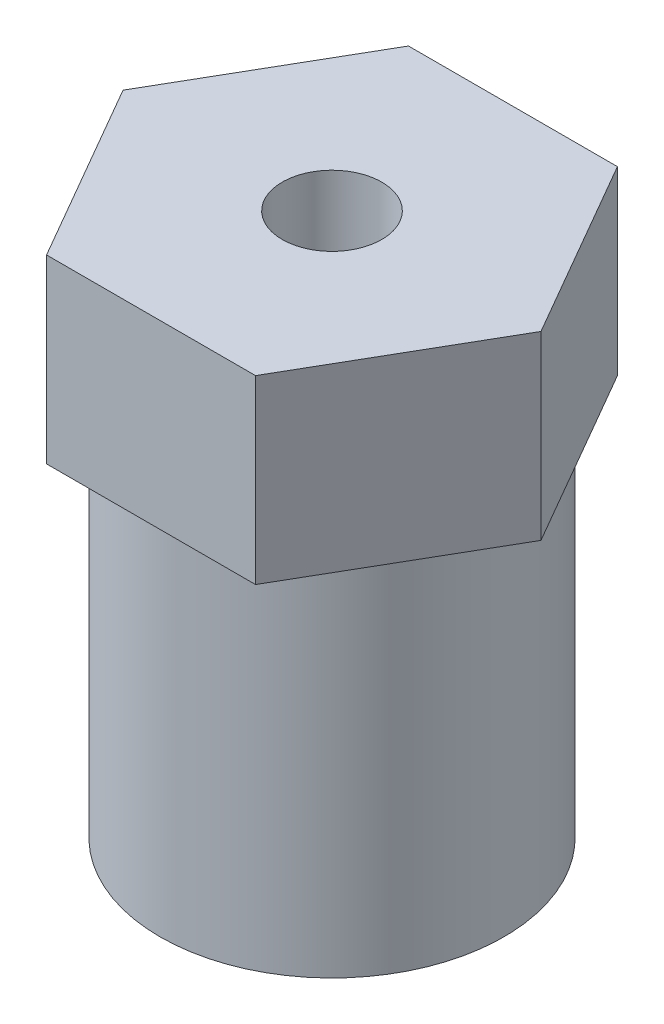
ISO-10303-21;
HEADER;
FILE_DESCRIPTION(('STEP AP214'),'2;1');
FILE_NAME('part.step','',(''),(''),'','','');
FILE_SCHEMA(('AUTOMOTIVE_DESIGN { 1 0 10303 214 1 1 1 1 }'));
ENDSEC;
DATA;
#1=APPLICATION_CONTEXT('core data for automotive mechanical design processes');
#2=APPLICATION_PROTOCOL_DEFINITION('international standard','automotive_design',2000,#1);
#3=PRODUCT_CONTEXT('',#1,'mechanical');
#4=PRODUCT('Part','Part','',(#3));
#5=PRODUCT_RELATED_PRODUCT_CATEGORY('part','',(#4));
#6=PRODUCT_DEFINITION_FORMATION('','',#4);
#7=PRODUCT_DEFINITION_CONTEXT('part definition',#1,'design');
#8=PRODUCT_DEFINITION('design','',#6,#7);
#9=PRODUCT_DEFINITION_SHAPE('','',#8);
#10=(LENGTH_UNIT() NAMED_UNIT(*) SI_UNIT(.MILLI.,.METRE.));
#11=(NAMED_UNIT(*) PLANE_ANGLE_UNIT() SI_UNIT($,.RADIAN.));
#12=(NAMED_UNIT(*) SI_UNIT($,.STERADIAN.) SOLID_ANGLE_UNIT());
#13=UNCERTAINTY_MEASURE_WITH_UNIT(LENGTH_MEASURE(1.E-05),#10,'distance_accuracy_value','');
#14=(GEOMETRIC_REPRESENTATION_CONTEXT(3) GLOBAL_UNCERTAINTY_ASSIGNED_CONTEXT((#13)) GLOBAL_UNIT_ASSIGNED_CONTEXT((#10,
#11,#12)) REPRESENTATION_CONTEXT('',''));
#15=CARTESIAN_POINT('',(0.,0.,0.));
#16=DIRECTION('',(0.,0.,1.));
#17=DIRECTION('',(1.,0.,0.));
#18=AXIS2_PLACEMENT_3D('',#15,#16,#17);
#19=CARTESIAN_POINT('',(0.,0.,0.));
#20=DIRECTION('',(0.,1.,0.));
#21=DIRECTION('',(0.,0.,1.));
#22=AXIS2_PLACEMENT_3D('',#19,#20,#21);
#23=PLANE('',#22);
#24=CARTESIAN_POINT('',(0.,0.,0.));
#25=DIRECTION('',(0.,1.,0.));
#26=DIRECTION('',(0.,0.,1.));
#27=AXIS2_PLACEMENT_3D('',#24,#25,#26);
#28=CIRCLE('',#27,5.7);
#29=CARTESIAN_POINT('',(0.,0.,5.7));
#30=VERTEX_POINT('',#29);
#31=EDGE_CURVE('E37',#30,#30,#28,.T.);
#32=ORIENTED_EDGE('',*,*,#31,.F.);
#33=EDGE_LOOP('',(#32));
#34=FACE_BOUND('',#33,.T.);
#35=CARTESIAN_POINT('',(0.,0.,0.));
#36=DIRECTION('',(0.,1.,0.));
#37=DIRECTION('',(0.,0.,1.));
#38=AXIS2_PLACEMENT_3D('',#35,#36,#37);
#39=CIRCLE('',#38,2.55);
#40=CARTESIAN_POINT('',(0.,0.,2.55));
#41=VERTEX_POINT('',#40);
#42=EDGE_CURVE('E143',#41,#41,#39,.T.);
#43=ORIENTED_EDGE('',*,*,#42,.T.);
#44=EDGE_LOOP('',(#43));
#45=FACE_BOUND('',#44,.T.);
#46=ADVANCED_FACE('F33',(#34,#45),#23,.F.);
#47=CARTESIAN_POINT('',(0.,12.,0.));
#48=DIRECTION('',(0.,-1.,0.));
#49=DIRECTION('',(0.,0.,-1.));
#50=AXIS2_PLACEMENT_3D('',#47,#48,#49);
#51=CYLINDRICAL_SURFACE('',#50,5.7);
#52=CARTESIAN_POINT('',(0.,12.,0.));
#53=DIRECTION('',(0.,1.,0.));
#54=DIRECTION('',(0.,0.,1.));
#55=AXIS2_PLACEMENT_3D('',#52,#53,#54);
#56=CIRCLE('',#55,5.7);
#57=CARTESIAN_POINT('',(0.,12.,5.7));
#58=VERTEX_POINT('',#57);
#59=EDGE_CURVE('E11',#58,#58,#56,.T.);
#60=ORIENTED_EDGE('',*,*,#59,.F.);
#61=EDGE_LOOP('',(#60));
#62=FACE_BOUND('',#61,.T.);
#63=ORIENTED_EDGE('',*,*,#31,.T.);
#64=EDGE_LOOP('',(#63));
#65=FACE_BOUND('',#64,.T.);
#66=ADVANCED_FACE('F35',(#62,#65),#51,.T.);
#67=CARTESIAN_POINT('',(0.,12.,0.));
#68=DIRECTION('',(0.,-1.,0.));
#69=DIRECTION('',(0.,0.,-1.));
#70=AXIS2_PLACEMENT_3D('',#67,#68,#69);
#71=CYLINDRICAL_SURFACE('',#70,2.55);
#72=CARTESIAN_POINT('',(0.,12.,0.));
#73=DIRECTION('',(0.,1.,0.));
#74=DIRECTION('',(0.,0.,1.));
#75=AXIS2_PLACEMENT_3D('',#72,#73,#74);
#76=CIRCLE('',#75,2.55);
#77=CARTESIAN_POINT('',(0.,12.,2.55));
#78=VERTEX_POINT('',#77);
#79=EDGE_CURVE('E140',#78,#78,#76,.T.);
#80=ORIENTED_EDGE('',*,*,#79,.T.);
#81=EDGE_LOOP('',(#80));
#82=FACE_BOUND('',#81,.T.);
#83=ORIENTED_EDGE('',*,*,#42,.F.);
#84=EDGE_LOOP('',(#83));
#85=FACE_BOUND('',#84,.T.);
#86=ADVANCED_FACE('F155',(#82,#85),#71,.F.);
#87=CARTESIAN_POINT('',(0.,12.,0.));
#88=DIRECTION('',(0.,1.,0.));
#89=DIRECTION('',(0.,0.,1.));
#90=AXIS2_PLACEMENT_3D('',#87,#88,#89);
#91=PLANE('',#90);
#92=CARTESIAN_POINT('',(0.,12.,0.));
#93=DIRECTION('',(0.,1.,0.));
#94=DIRECTION('',(0.,0.,1.));
#95=AXIS2_PLACEMENT_3D('',#92,#93,#94);
#96=CIRCLE('',#95,1.65);
#97=CARTESIAN_POINT('',(0.,12.,1.65));
#98=VERTEX_POINT('',#97);
#99=EDGE_CURVE('E196',#98,#98,#96,.T.);
#100=ORIENTED_EDGE('',*,*,#99,.T.);
#101=EDGE_LOOP('',(#100));
#102=FACE_BOUND('',#101,.T.);
#103=ORIENTED_EDGE('',*,*,#79,.F.);
#104=EDGE_LOOP('',(#103));
#105=FACE_BOUND('',#104,.T.);
#106=ADVANCED_FACE('F160',(#102,#105),#91,.F.);
#107=CARTESIAN_POINT('',(0.,18.,0.));
#108=DIRECTION('',(0.,1.,0.));
#109=DIRECTION('',(0.,0.,1.));
#110=AXIS2_PLACEMENT_3D('',#107,#108,#109);
#111=PLANE('',#110);
#112=DIRECTION('',(0.5,0.,-0.866025403784439));
#113=VECTOR('',#112,1.);
#114=CARTESIAN_POINT('',(3.46410161513775,18.,6.));
#115=LINE('',#114,#113);
#116=CARTESIAN_POINT('',(3.46410161513775,18.,6.));
#117=VERTEX_POINT('',#116);
#118=CARTESIAN_POINT('',(6.9282032302755,18.,0.));
#119=VERTEX_POINT('',#118);
#120=EDGE_CURVE('E131',#117,#119,#115,.T.);
#121=ORIENTED_EDGE('',*,*,#120,.T.);
#122=DIRECTION('',(-0.5,0.,-0.866025403784439));
#123=VECTOR('',#122,1.);
#124=CARTESIAN_POINT('',(6.9282032302755,18.,0.));
#125=LINE('',#124,#123);
#126=CARTESIAN_POINT('',(3.46410161513775,18.,-6.));
#127=VERTEX_POINT('',#126);
#128=EDGE_CURVE('E88',#119,#127,#125,.T.);
#129=ORIENTED_EDGE('',*,*,#128,.T.);
#130=DIRECTION('',(-1.,0.,0.));
#131=VECTOR('',#130,1.);
#132=CARTESIAN_POINT('',(3.46410161513775,18.,-6.));
#133=LINE('',#132,#131);
#134=CARTESIAN_POINT('',(-3.46410161513775,18.,-6.));
#135=VERTEX_POINT('',#134);
#136=EDGE_CURVE('E102',#127,#135,#133,.T.);
#137=ORIENTED_EDGE('',*,*,#136,.T.);
#138=DIRECTION('',(-0.5,0.,0.866025403784439));
#139=VECTOR('',#138,1.);
#140=CARTESIAN_POINT('',(-3.46410161513775,18.,-6.));
#141=LINE('',#140,#139);
#142=CARTESIAN_POINT('',(-6.92820323027551,18.,0.));
#143=VERTEX_POINT('',#142);
#144=EDGE_CURVE('E95',#135,#143,#141,.T.);
#145=ORIENTED_EDGE('',*,*,#144,.T.);
#146=DIRECTION('',(0.5,0.,0.866025403784439));
#147=VECTOR('',#146,1.);
#148=CARTESIAN_POINT('',(-6.92820323027551,18.,0.));
#149=LINE('',#148,#147);
#150=CARTESIAN_POINT('',(-3.46410161513776,18.,6.));
#151=VERTEX_POINT('',#150);
#152=EDGE_CURVE('E100',#143,#151,#149,.T.);
#153=ORIENTED_EDGE('',*,*,#152,.T.);
#154=DIRECTION('',(1.,0.,0.));
#155=VECTOR('',#154,1.);
#156=CARTESIAN_POINT('',(-3.46410161513776,18.,6.));
#157=LINE('',#156,#155);
#158=EDGE_CURVE('E50',#151,#117,#157,.T.);
#159=ORIENTED_EDGE('',*,*,#158,.T.);
#160=EDGE_LOOP('',(#121,#129,#137,#145,#153,#159));
#161=FACE_BOUND('',#160,.T.);
#162=CARTESIAN_POINT('',(0.,18.,0.));
#163=DIRECTION('',(0.,1.,0.));
#164=DIRECTION('',(0.,0.,1.));
#165=AXIS2_PLACEMENT_3D('',#162,#163,#164);
#166=CIRCLE('',#165,1.65);
#167=CARTESIAN_POINT('',(0.,18.,1.65));
#168=VERTEX_POINT('',#167);
#169=EDGE_CURVE('E124',#168,#168,#166,.T.);
#170=ORIENTED_EDGE('',*,*,#169,.F.);
#171=EDGE_LOOP('',(#170));
#172=FACE_BOUND('',#171,.T.);
#173=ADVANCED_FACE('F97',(#161,#172),#111,.T.);
#174=ORIENTED_EDGE('',*,*,#59,.T.);
#175=EDGE_LOOP('',(#174));
#176=FACE_BOUND('',#175,.T.);
#177=DIRECTION('',(0.5,0.,-0.866025403784439));
#178=VECTOR('',#177,1.);
#179=CARTESIAN_POINT('',(3.46410161513775,12.,6.));
#180=LINE('',#179,#178);
#181=CARTESIAN_POINT('',(3.46410161513775,12.,6.));
#182=VERTEX_POINT('',#181);
#183=CARTESIAN_POINT('',(6.9282032302755,12.,0.));
#184=VERTEX_POINT('',#183);
#185=EDGE_CURVE('E120',#182,#184,#180,.T.);
#186=ORIENTED_EDGE('',*,*,#185,.F.);
#187=DIRECTION('',(1.,0.,0.));
#188=VECTOR('',#187,1.);
#189=CARTESIAN_POINT('',(-3.46410161513776,12.,6.));
#190=LINE('',#189,#188);
#191=CARTESIAN_POINT('',(-3.46410161513776,12.,6.));
#192=VERTEX_POINT('',#191);
#193=EDGE_CURVE('E79',#192,#182,#190,.T.);
#194=ORIENTED_EDGE('',*,*,#193,.F.);
#195=DIRECTION('',(0.5,0.,0.866025403784439));
#196=VECTOR('',#195,1.);
#197=CARTESIAN_POINT('',(-6.92820323027551,12.,0.));
#198=LINE('',#197,#196);
#199=CARTESIAN_POINT('',(-6.92820323027551,12.,0.));
#200=VERTEX_POINT('',#199);
#201=EDGE_CURVE('E73',#200,#192,#198,.T.);
#202=ORIENTED_EDGE('',*,*,#201,.F.);
#203=DIRECTION('',(-0.5,0.,0.866025403784439));
#204=VECTOR('',#203,1.);
#205=CARTESIAN_POINT('',(-3.46410161513775,12.,-6.));
#206=LINE('',#205,#204);
#207=CARTESIAN_POINT('',(-3.46410161513775,12.,-6.));
#208=VERTEX_POINT('',#207);
#209=EDGE_CURVE('E110',#208,#200,#206,.T.);
#210=ORIENTED_EDGE('',*,*,#209,.F.);
#211=DIRECTION('',(-1.,0.,0.));
#212=VECTOR('',#211,1.);
#213=CARTESIAN_POINT('',(3.46410161513775,12.,-6.));
#214=LINE('',#213,#212);
#215=CARTESIAN_POINT('',(3.46410161513775,12.,-6.));
#216=VERTEX_POINT('',#215);
#217=EDGE_CURVE('E126',#216,#208,#214,.T.);
#218=ORIENTED_EDGE('',*,*,#217,.F.);
#219=DIRECTION('',(-0.5,0.,-0.866025403784439));
#220=VECTOR('',#219,1.);
#221=CARTESIAN_POINT('',(6.9282032302755,12.,0.));
#222=LINE('',#221,#220);
#223=EDGE_CURVE('E123',#184,#216,#222,.T.);
#224=ORIENTED_EDGE('',*,*,#223,.F.);
#225=EDGE_LOOP('',(#186,#194,#202,#210,#218,#224));
#226=FACE_BOUND('',#225,.T.);
#227=ADVANCED_FACE('F166',(#176,#226),#91,.F.);
#228=CARTESIAN_POINT('',(3.46410161513775,18.,6.));
#229=DIRECTION('',(-0.866025403784439,0.,-0.5));
#230=DIRECTION('',(-0.5,0.,0.866025403784439));
#231=AXIS2_PLACEMENT_3D('',#228,#229,#230);
#232=PLANE('',#231);
#233=ORIENTED_EDGE('',*,*,#185,.T.);
#234=DIRECTION('',(0.,-1.,0.));
#235=VECTOR('',#234,1.);
#236=CARTESIAN_POINT('',(6.9282032302755,18.,0.));
#237=LINE('',#236,#235);
#238=EDGE_CURVE('E138',#119,#184,#237,.T.);
#239=ORIENTED_EDGE('',*,*,#238,.F.);
#240=ORIENTED_EDGE('',*,*,#120,.F.);
#241=DIRECTION('',(0.,-1.,0.));
#242=VECTOR('',#241,1.);
#243=CARTESIAN_POINT('',(3.46410161513775,18.,6.));
#244=LINE('',#243,#242);
#245=EDGE_CURVE('E116',#117,#182,#244,.T.);
#246=ORIENTED_EDGE('',*,*,#245,.T.);
#247=EDGE_LOOP('',(#233,#239,#240,#246));
#248=FACE_BOUND('',#247,.T.);
#249=ADVANCED_FACE('F162',(#248),#232,.F.);
#250=CARTESIAN_POINT('',(6.9282032302755,18.,0.));
#251=DIRECTION('',(-0.866025403784439,0.,0.5));
#252=DIRECTION('',(0.5,0.,0.866025403784439));
#253=AXIS2_PLACEMENT_3D('',#250,#251,#252);
#254=PLANE('',#253);
#255=ORIENTED_EDGE('',*,*,#223,.T.);
#256=DIRECTION('',(0.,-1.,0.));
#257=VECTOR('',#256,1.);
#258=CARTESIAN_POINT('',(3.46410161513775,18.,-6.));
#259=LINE('',#258,#257);
#260=EDGE_CURVE('E135',#127,#216,#259,.T.);
#261=ORIENTED_EDGE('',*,*,#260,.F.);
#262=ORIENTED_EDGE('',*,*,#128,.F.);
#263=ORIENTED_EDGE('',*,*,#238,.T.);
#264=EDGE_LOOP('',(#255,#261,#262,#263));
#265=FACE_BOUND('',#264,.T.);
#266=ADVANCED_FACE('F165',(#265),#254,.F.);
#267=CARTESIAN_POINT('',(3.46410161513775,18.,-6.));
#268=DIRECTION('',(0.,0.,1.));
#269=DIRECTION('',(1.,0.,0.));
#270=AXIS2_PLACEMENT_3D('',#267,#268,#269);
#271=PLANE('',#270);
#272=ORIENTED_EDGE('',*,*,#217,.T.);
#273=DIRECTION('',(0.,-1.,0.));
#274=VECTOR('',#273,1.);
#275=CARTESIAN_POINT('',(-3.46410161513775,18.,-6.));
#276=LINE('',#275,#274);
#277=EDGE_CURVE('E111',#135,#208,#276,.T.);
#278=ORIENTED_EDGE('',*,*,#277,.F.);
#279=ORIENTED_EDGE('',*,*,#136,.F.);
#280=ORIENTED_EDGE('',*,*,#260,.T.);
#281=EDGE_LOOP('',(#272,#278,#279,#280));
#282=FACE_BOUND('',#281,.T.);
#283=ADVANCED_FACE('F170',(#282),#271,.F.);
#284=CARTESIAN_POINT('',(-3.46410161513775,18.,-6.));
#285=DIRECTION('',(0.866025403784439,0.,0.5));
#286=DIRECTION('',(0.5,0.,-0.866025403784439));
#287=AXIS2_PLACEMENT_3D('',#284,#285,#286);
#288=PLANE('',#287);
#289=ORIENTED_EDGE('',*,*,#209,.T.);
#290=DIRECTION('',(0.,-1.,0.));
#291=VECTOR('',#290,1.);
#292=CARTESIAN_POINT('',(-6.92820323027551,18.,0.));
#293=LINE('',#292,#291);
#294=EDGE_CURVE('E107',#143,#200,#293,.T.);
#295=ORIENTED_EDGE('',*,*,#294,.F.);
#296=ORIENTED_EDGE('',*,*,#144,.F.);
#297=ORIENTED_EDGE('',*,*,#277,.T.);
#298=EDGE_LOOP('',(#289,#295,#296,#297));
#299=FACE_BOUND('',#298,.T.);
#300=ADVANCED_FACE('F108',(#299),#288,.F.);
#301=CARTESIAN_POINT('',(-6.92820323027551,18.,0.));
#302=DIRECTION('',(0.866025403784439,0.,-0.5));
#303=DIRECTION('',(-0.5,0.,-0.866025403784439));
#304=AXIS2_PLACEMENT_3D('',#301,#302,#303);
#305=PLANE('',#304);
#306=ORIENTED_EDGE('',*,*,#201,.T.);
#307=DIRECTION('',(0.,-1.,0.));
#308=VECTOR('',#307,1.);
#309=CARTESIAN_POINT('',(-3.46410161513776,18.,6.));
#310=LINE('',#309,#308);
#311=EDGE_CURVE('E112',#151,#192,#310,.T.);
#312=ORIENTED_EDGE('',*,*,#311,.F.);
#313=ORIENTED_EDGE('',*,*,#152,.F.);
#314=ORIENTED_EDGE('',*,*,#294,.T.);
#315=EDGE_LOOP('',(#306,#312,#313,#314));
#316=FACE_BOUND('',#315,.T.);
#317=ADVANCED_FACE('F114',(#316),#305,.F.);
#318=CARTESIAN_POINT('',(-3.46410161513776,18.,6.));
#319=DIRECTION('',(0.,0.,-1.));
#320=DIRECTION('',(-1.,0.,0.));
#321=AXIS2_PLACEMENT_3D('',#318,#319,#320);
#322=PLANE('',#321);
#323=ORIENTED_EDGE('',*,*,#193,.T.);
#324=ORIENTED_EDGE('',*,*,#245,.F.);
#325=ORIENTED_EDGE('',*,*,#158,.F.);
#326=ORIENTED_EDGE('',*,*,#311,.T.);
#327=EDGE_LOOP('',(#323,#324,#325,#326));
#328=FACE_BOUND('',#327,.T.);
#329=ADVANCED_FACE('F178',(#328),#322,.F.);
#330=CARTESIAN_POINT('',(0.,18.,0.));
#331=DIRECTION('',(0.,-1.,0.));
#332=DIRECTION('',(0.,0.,-1.));
#333=AXIS2_PLACEMENT_3D('',#330,#331,#332);
#334=CYLINDRICAL_SURFACE('',#333,1.65);
#335=ORIENTED_EDGE('',*,*,#169,.T.);
#336=EDGE_LOOP('',(#335));
#337=FACE_BOUND('',#336,.T.);
#338=ORIENTED_EDGE('',*,*,#99,.F.);
#339=EDGE_LOOP('',(#338));
#340=FACE_BOUND('',#339,.T.);
#341=ADVANCED_FACE('F181',(#337,#340),#334,.F.);
#342=CLOSED_SHELL('',(#46,#66,#86,#106,#173,#227,#249,#266,#283,#300,#317,#329,#341));
#343=MANIFOLD_SOLID_BREP('B2',#342);
#344=ADVANCED_BREP_SHAPE_REPRESENTATION('',(#18,#343),#14);
#345=SHAPE_DEFINITION_REPRESENTATION(#9,#344);
ENDSEC;
END-ISO-10303-21;
